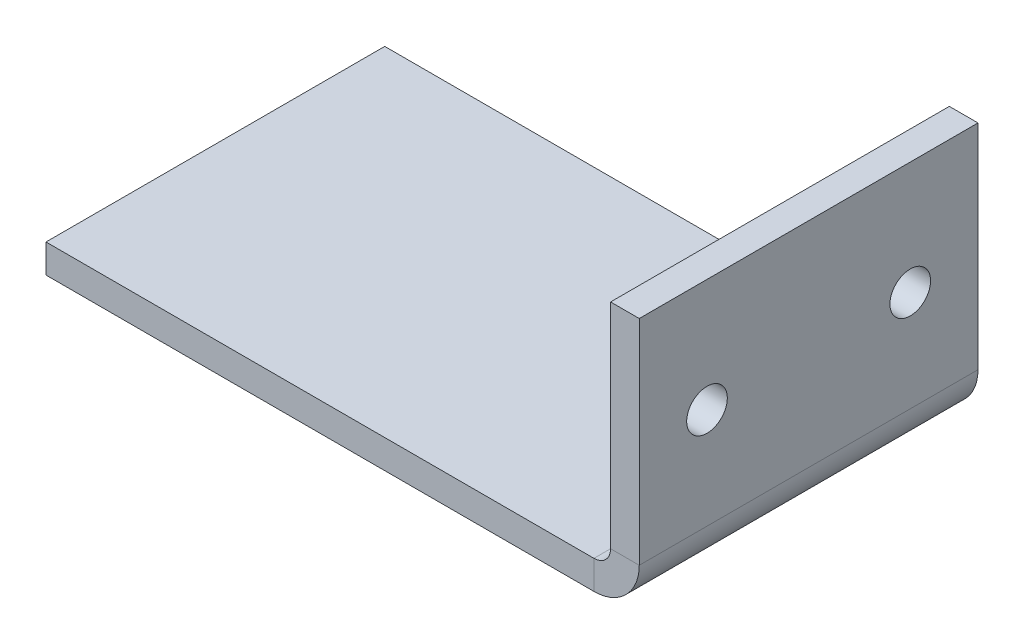
ISO-10303-21;
HEADER;
FILE_DESCRIPTION(('STEP AP214'),'2;1');
FILE_NAME('part.step','',(''),(''),'','','');
FILE_SCHEMA(('AUTOMOTIVE_DESIGN { 1 0 10303 214 1 1 1 1 }'));
ENDSEC;
DATA;
#1=APPLICATION_CONTEXT('core data for automotive mechanical design processes');
#2=APPLICATION_PROTOCOL_DEFINITION('international standard','automotive_design',2000,#1);
#3=PRODUCT_CONTEXT('',#1,'mechanical');
#4=PRODUCT('Part','Part','',(#3));
#5=PRODUCT_RELATED_PRODUCT_CATEGORY('part','',(#4));
#6=PRODUCT_DEFINITION_FORMATION('','',#4);
#7=PRODUCT_DEFINITION_CONTEXT('part definition',#1,'design');
#8=PRODUCT_DEFINITION('design','',#6,#7);
#9=PRODUCT_DEFINITION_SHAPE('','',#8);
#10=(LENGTH_UNIT() NAMED_UNIT(*) SI_UNIT(.MILLI.,.METRE.));
#11=(NAMED_UNIT(*) PLANE_ANGLE_UNIT() SI_UNIT($,.RADIAN.));
#12=(NAMED_UNIT(*) SI_UNIT($,.STERADIAN.) SOLID_ANGLE_UNIT());
#13=UNCERTAINTY_MEASURE_WITH_UNIT(LENGTH_MEASURE(1.E-05),#10,'distance_accuracy_value','');
#14=(GEOMETRIC_REPRESENTATION_CONTEXT(3) GLOBAL_UNCERTAINTY_ASSIGNED_CONTEXT((#13)) GLOBAL_UNIT_ASSIGNED_CONTEXT((#10,
#11,#12)) REPRESENTATION_CONTEXT('',''));
#15=CARTESIAN_POINT('',(0.,0.,0.));
#16=DIRECTION('',(0.,0.,1.));
#17=DIRECTION('',(1.,0.,0.));
#18=AXIS2_PLACEMENT_3D('',#15,#16,#17);
#19=CARTESIAN_POINT('',(-12.5,-1.27,-7.5));
#20=DIRECTION('',(0.,0.,-1.));
#21=DIRECTION('',(-1.,0.,0.));
#22=AXIS2_PLACEMENT_3D('',#19,#20,#21);
#23=PLANE('',#22);
#24=DIRECTION('',(-1.,0.,0.));
#25=VECTOR('',#24,1.);
#26=CARTESIAN_POINT('',(-12.5,0.,-7.5));
#27=LINE('',#26,#25);
#28=CARTESIAN_POINT('',(11.7634,0.,-7.5));
#29=VERTEX_POINT('',#28);
#30=CARTESIAN_POINT('',(-12.5,0.,-7.5));
#31=VERTEX_POINT('',#30);
#32=EDGE_CURVE('E87',#29,#31,#27,.T.);
#33=ORIENTED_EDGE('',*,*,#32,.F.);
#34=DIRECTION('',(0.,-1.,0.));
#35=VECTOR('',#34,1.);
#36=CARTESIAN_POINT('',(11.7634,0.,-7.5));
#37=LINE('',#36,#35);
#38=CARTESIAN_POINT('',(11.7634,-1.27,-7.5));
#39=VERTEX_POINT('',#38);
#40=EDGE_CURVE('E102',#29,#39,#37,.T.);
#41=ORIENTED_EDGE('',*,*,#40,.T.);
#42=DIRECTION('',(-1.,0.,0.));
#43=VECTOR('',#42,1.);
#44=CARTESIAN_POINT('',(-12.5,-1.27,-7.5));
#45=LINE('',#44,#43);
#46=CARTESIAN_POINT('',(-12.5,-1.27,-7.5));
#47=VERTEX_POINT('',#46);
#48=EDGE_CURVE('E94',#39,#47,#45,.T.);
#49=ORIENTED_EDGE('',*,*,#48,.T.);
#50=DIRECTION('',(0.,1.,0.));
#51=VECTOR('',#50,1.);
#52=CARTESIAN_POINT('',(-12.5,-1.27,-7.5));
#53=LINE('',#52,#51);
#54=EDGE_CURVE('E48',#47,#31,#53,.T.);
#55=ORIENTED_EDGE('',*,*,#54,.T.);
#56=EDGE_LOOP('',(#33,#41,#49,#55));
#57=FACE_BOUND('',#56,.T.);
#58=ADVANCED_FACE('F45',(#57),#23,.T.);
#59=CARTESIAN_POINT('',(0.,-1.27,0.));
#60=DIRECTION('',(0.,1.,0.));
#61=DIRECTION('',(0.,0.,1.));
#62=AXIS2_PLACEMENT_3D('',#59,#60,#61);
#63=PLANE('',#62);
#64=DIRECTION('',(0.,0.,-1.));
#65=VECTOR('',#64,1.);
#66=CARTESIAN_POINT('',(11.7634,-1.27,-7.5));
#67=LINE('',#66,#65);
#68=CARTESIAN_POINT('',(11.7634,-1.27,7.5));
#69=VERTEX_POINT('',#68);
#70=EDGE_CURVE('E118',#39,#69,#67,.F.);
#71=ORIENTED_EDGE('',*,*,#70,.T.);
#72=DIRECTION('',(1.,0.,0.));
#73=VECTOR('',#72,1.);
#74=CARTESIAN_POINT('',(-12.5,-1.27,7.5));
#75=LINE('',#74,#73);
#76=CARTESIAN_POINT('',(-12.5,-1.27,7.5));
#77=VERTEX_POINT('',#76);
#78=EDGE_CURVE('E99',#77,#69,#75,.T.);
#79=ORIENTED_EDGE('',*,*,#78,.F.);
#80=DIRECTION('',(0.,0.,1.));
#81=VECTOR('',#80,1.);
#82=CARTESIAN_POINT('',(-12.5,-1.27,-7.5));
#83=LINE('',#82,#81);
#84=EDGE_CURVE('E82',#47,#77,#83,.T.);
#85=ORIENTED_EDGE('',*,*,#84,.F.);
#86=ORIENTED_EDGE('',*,*,#48,.F.);
#87=EDGE_LOOP('',(#71,#79,#85,#86));
#88=FACE_BOUND('',#87,.T.);
#89=ADVANCED_FACE('F222',(#88),#63,.F.);
#90=CARTESIAN_POINT('',(0.,0.,0.));
#91=DIRECTION('',(0.,1.,0.));
#92=DIRECTION('',(0.,0.,1.));
#93=AXIS2_PLACEMENT_3D('',#90,#91,#92);
#94=PLANE('',#93);
#95=DIRECTION('',(1.,0.,0.));
#96=VECTOR('',#95,1.);
#97=CARTESIAN_POINT('',(-12.5,0.,7.5));
#98=LINE('',#97,#96);
#99=CARTESIAN_POINT('',(-12.5,0.,7.5));
#100=VERTEX_POINT('',#99);
#101=CARTESIAN_POINT('',(11.7634,0.,7.5));
#102=VERTEX_POINT('',#101);
#103=EDGE_CURVE('E86',#100,#102,#98,.T.);
#104=ORIENTED_EDGE('',*,*,#103,.T.);
#105=DIRECTION('',(0.,0.,-1.));
#106=VECTOR('',#105,1.);
#107=CARTESIAN_POINT('',(11.7634,0.,-7.5));
#108=LINE('',#107,#106);
#109=EDGE_CURVE('E59',#29,#102,#108,.F.);
#110=ORIENTED_EDGE('',*,*,#109,.F.);
#111=ORIENTED_EDGE('',*,*,#32,.T.);
#112=DIRECTION('',(0.,0.,1.));
#113=VECTOR('',#112,1.);
#114=CARTESIAN_POINT('',(-12.5,0.,-7.5));
#115=LINE('',#114,#113);
#116=EDGE_CURVE('E80',#31,#100,#115,.T.);
#117=ORIENTED_EDGE('',*,*,#116,.T.);
#118=EDGE_LOOP('',(#104,#110,#111,#117));
#119=FACE_BOUND('',#118,.T.);
#120=ADVANCED_FACE('F84',(#119),#94,.T.);
#121=CARTESIAN_POINT('',(-12.5,-1.27,7.5));
#122=DIRECTION('',(0.,0.,1.));
#123=DIRECTION('',(1.,0.,0.));
#124=AXIS2_PLACEMENT_3D('',#121,#122,#123);
#125=PLANE('',#124);
#126=DIRECTION('',(0.,-1.,0.));
#127=VECTOR('',#126,1.);
#128=CARTESIAN_POINT('',(11.7634,0.,7.5));
#129=LINE('',#128,#127);
#130=EDGE_CURVE('E93',#102,#69,#129,.T.);
#131=ORIENTED_EDGE('',*,*,#130,.F.);
#132=ORIENTED_EDGE('',*,*,#103,.F.);
#133=DIRECTION('',(0.,1.,0.));
#134=VECTOR('',#133,1.);
#135=CARTESIAN_POINT('',(-12.5,-1.27,7.5));
#136=LINE('',#135,#134);
#137=EDGE_CURVE('E11',#77,#100,#136,.T.);
#138=ORIENTED_EDGE('',*,*,#137,.F.);
#139=ORIENTED_EDGE('',*,*,#78,.T.);
#140=EDGE_LOOP('',(#131,#132,#138,#139));
#141=FACE_BOUND('',#140,.T.);
#142=ADVANCED_FACE('F91',(#141),#125,.T.);
#143=CARTESIAN_POINT('',(-12.5,-1.27,-7.5));
#144=DIRECTION('',(-1.,0.,0.));
#145=DIRECTION('',(0.,0.,1.));
#146=AXIS2_PLACEMENT_3D('',#143,#144,#145);
#147=PLANE('',#146);
#148=ORIENTED_EDGE('',*,*,#116,.F.);
#149=ORIENTED_EDGE('',*,*,#54,.F.);
#150=ORIENTED_EDGE('',*,*,#84,.T.);
#151=ORIENTED_EDGE('',*,*,#137,.T.);
#152=EDGE_LOOP('',(#148,#149,#150,#151));
#153=FACE_BOUND('',#152,.T.);
#154=ADVANCED_FACE('F78',(#153),#147,.T.);
#155=CARTESIAN_POINT('',(11.7634,0.7366,7.5));
#156=DIRECTION('',(0.,0.,1.));
#157=DIRECTION('',(0.,-1.,0.));
#158=AXIS2_PLACEMENT_3D('',#155,#156,#157);
#159=PLANE('',#158);
#160=DIRECTION('',(1.,0.,0.));
#161=VECTOR('',#160,1.);
#162=CARTESIAN_POINT('',(12.5,0.736599999999997,7.5));
#163=LINE('',#162,#161);
#164=CARTESIAN_POINT('',(12.5,0.736599999999997,7.5));
#165=VERTEX_POINT('',#164);
#166=CARTESIAN_POINT('',(13.77,0.736599999999993,7.5));
#167=VERTEX_POINT('',#166);
#168=EDGE_CURVE('E152',#165,#167,#163,.T.);
#169=ORIENTED_EDGE('',*,*,#168,.F.);
#170=CARTESIAN_POINT('',(11.7634,0.7366,7.5));
#171=DIRECTION('',(0.,0.,-1.));
#172=DIRECTION('',(0.,1.,0.));
#173=AXIS2_PLACEMENT_3D('',#170,#171,#172);
#174=CIRCLE('',#173,0.7366);
#175=EDGE_CURVE('E112',#102,#165,#174,.F.);
#176=ORIENTED_EDGE('',*,*,#175,.F.);
#177=ORIENTED_EDGE('',*,*,#130,.T.);
#178=CARTESIAN_POINT('',(11.7634,0.7366,7.5));
#179=DIRECTION('',(0.,0.,-1.));
#180=DIRECTION('',(0.,1.,0.));
#181=AXIS2_PLACEMENT_3D('',#178,#179,#180);
#182=CIRCLE('',#181,2.0066);
#183=EDGE_CURVE('E105',#69,#167,#182,.F.);
#184=ORIENTED_EDGE('',*,*,#183,.T.);
#185=EDGE_LOOP('',(#169,#176,#177,#184));
#186=FACE_BOUND('',#185,.T.);
#187=ADVANCED_FACE('F225',(#186),#159,.T.);
#188=CARTESIAN_POINT('',(11.7634,0.736599999999997,-7.5));
#189=DIRECTION('',(0.,0.,1.));
#190=DIRECTION('',(0.,-1.,0.));
#191=AXIS2_PLACEMENT_3D('',#188,#189,#190);
#192=PLANE('',#191);
#193=CARTESIAN_POINT('',(11.7634,0.736599999999997,-7.5));
#194=DIRECTION('',(0.,0.,-1.));
#195=DIRECTION('',(0.,1.,0.));
#196=AXIS2_PLACEMENT_3D('',#193,#194,#195);
#197=CIRCLE('',#196,0.7366);
#198=CARTESIAN_POINT('',(12.5,0.736599999999995,-7.5));
#199=VERTEX_POINT('',#198);
#200=EDGE_CURVE('E107',#199,#29,#197,.T.);
#201=ORIENTED_EDGE('',*,*,#200,.F.);
#202=DIRECTION('',(1.,0.,0.));
#203=VECTOR('',#202,1.);
#204=CARTESIAN_POINT('',(12.5,0.736599999999995,-7.5));
#205=LINE('',#204,#203);
#206=CARTESIAN_POINT('',(13.77,0.736599999999991,-7.5));
#207=VERTEX_POINT('',#206);
#208=EDGE_CURVE('E151',#199,#207,#205,.T.);
#209=ORIENTED_EDGE('',*,*,#208,.T.);
#210=CARTESIAN_POINT('',(11.7634,0.736599999999997,-7.5));
#211=DIRECTION('',(0.,0.,-1.));
#212=DIRECTION('',(0.,1.,0.));
#213=AXIS2_PLACEMENT_3D('',#210,#211,#212);
#214=CIRCLE('',#213,2.0066);
#215=EDGE_CURVE('E115',#207,#39,#214,.T.);
#216=ORIENTED_EDGE('',*,*,#215,.T.);
#217=ORIENTED_EDGE('',*,*,#40,.F.);
#218=EDGE_LOOP('',(#201,#209,#216,#217));
#219=FACE_BOUND('',#218,.T.);
#220=ADVANCED_FACE('F229',(#219),#192,.F.);
#221=CARTESIAN_POINT('',(11.7634,0.736599999999997,-7.5));
#222=DIRECTION('',(0.,0.,-1.));
#223=DIRECTION('',(1.,0.,0.));
#224=AXIS2_PLACEMENT_3D('',#221,#222,#223);
#225=CYLINDRICAL_SURFACE('',#224,2.0066);
#226=ORIENTED_EDGE('',*,*,#70,.F.);
#227=ORIENTED_EDGE('',*,*,#215,.F.);
#228=DIRECTION('',(0.,0.,1.));
#229=VECTOR('',#228,1.);
#230=CARTESIAN_POINT('',(13.77,0.736599999999992,0.));
#231=LINE('',#230,#229);
#232=EDGE_CURVE('E140',#207,#167,#231,.T.);
#233=ORIENTED_EDGE('',*,*,#232,.T.);
#234=ORIENTED_EDGE('',*,*,#183,.F.);
#235=EDGE_LOOP('',(#226,#227,#233,#234));
#236=FACE_BOUND('',#235,.T.);
#237=ADVANCED_FACE('F226',(#236),#225,.T.);
#238=CARTESIAN_POINT('',(11.7634,0.736599999999997,-7.5));
#239=DIRECTION('',(0.,0.,-1.));
#240=DIRECTION('',(1.,0.,0.));
#241=AXIS2_PLACEMENT_3D('',#238,#239,#240);
#242=CYLINDRICAL_SURFACE('',#241,0.7366);
#243=ORIENTED_EDGE('',*,*,#109,.T.);
#244=ORIENTED_EDGE('',*,*,#175,.T.);
#245=DIRECTION('',(0.,0.,-1.));
#246=VECTOR('',#245,1.);
#247=CARTESIAN_POINT('',(12.5,0.736599999999997,7.5));
#248=LINE('',#247,#246);
#249=EDGE_CURVE('E155',#165,#199,#248,.T.);
#250=ORIENTED_EDGE('',*,*,#249,.T.);
#251=ORIENTED_EDGE('',*,*,#200,.T.);
#252=EDGE_LOOP('',(#243,#244,#250,#251));
#253=FACE_BOUND('',#252,.T.);
#254=ADVANCED_FACE('F228',(#253),#242,.F.);
#255=CARTESIAN_POINT('',(13.77,10.2,-7.5));
#256=DIRECTION('',(0.,0.,1.));
#257=DIRECTION('',(1.,0.,0.));
#258=AXIS2_PLACEMENT_3D('',#255,#256,#257);
#259=PLANE('',#258);
#260=ORIENTED_EDGE('',*,*,#208,.F.);
#261=DIRECTION('',(0.,1.,0.));
#262=VECTOR('',#261,1.);
#263=CARTESIAN_POINT('',(12.5,10.2,-7.5));
#264=LINE('',#263,#262);
#265=CARTESIAN_POINT('',(12.5,10.2,-7.5));
#266=VERTEX_POINT('',#265);
#267=EDGE_CURVE('E136',#199,#266,#264,.T.);
#268=ORIENTED_EDGE('',*,*,#267,.T.);
#269=DIRECTION('',(-1.,0.,0.));
#270=VECTOR('',#269,1.);
#271=CARTESIAN_POINT('',(13.77,10.2,-7.5));
#272=LINE('',#271,#270);
#273=CARTESIAN_POINT('',(13.77,10.2,-7.5));
#274=VERTEX_POINT('',#273);
#275=EDGE_CURVE('E110',#274,#266,#272,.T.);
#276=ORIENTED_EDGE('',*,*,#275,.F.);
#277=DIRECTION('',(0.,1.,0.));
#278=VECTOR('',#277,1.);
#279=CARTESIAN_POINT('',(13.77,10.2,-7.5));
#280=LINE('',#279,#278);
#281=EDGE_CURVE('E132',#207,#274,#280,.T.);
#282=ORIENTED_EDGE('',*,*,#281,.F.);
#283=EDGE_LOOP('',(#260,#268,#276,#282));
#284=FACE_BOUND('',#283,.T.);
#285=ADVANCED_FACE('F197',(#284),#259,.F.);
#286=CARTESIAN_POINT('',(13.77,0.,7.5));
#287=DIRECTION('',(0.,0.,-1.));
#288=DIRECTION('',(-1.,0.,0.));
#289=AXIS2_PLACEMENT_3D('',#286,#287,#288);
#290=PLANE('',#289);
#291=ORIENTED_EDGE('',*,*,#168,.T.);
#292=DIRECTION('',(0.,-1.,0.));
#293=VECTOR('',#292,1.);
#294=CARTESIAN_POINT('',(13.77,0.,7.5));
#295=LINE('',#294,#293);
#296=CARTESIAN_POINT('',(13.77,10.2,7.5));
#297=VERTEX_POINT('',#296);
#298=EDGE_CURVE('E128',#297,#167,#295,.T.);
#299=ORIENTED_EDGE('',*,*,#298,.F.);
#300=DIRECTION('',(-1.,0.,0.));
#301=VECTOR('',#300,1.);
#302=CARTESIAN_POINT('',(13.77,10.2,7.5));
#303=LINE('',#302,#301);
#304=CARTESIAN_POINT('',(12.5,10.2,7.5));
#305=VERTEX_POINT('',#304);
#306=EDGE_CURVE('E125',#297,#305,#303,.T.);
#307=ORIENTED_EDGE('',*,*,#306,.T.);
#308=DIRECTION('',(0.,-1.,0.));
#309=VECTOR('',#308,1.);
#310=CARTESIAN_POINT('',(12.5,0.,7.5));
#311=LINE('',#310,#309);
#312=EDGE_CURVE('E129',#305,#165,#311,.T.);
#313=ORIENTED_EDGE('',*,*,#312,.T.);
#314=EDGE_LOOP('',(#291,#299,#307,#313));
#315=FACE_BOUND('',#314,.T.);
#316=ADVANCED_FACE('F179',(#315),#290,.F.);
#317=CARTESIAN_POINT('',(13.77,0.,0.));
#318=DIRECTION('',(-1.,0.,0.));
#319=DIRECTION('',(0.,-1.,0.));
#320=AXIS2_PLACEMENT_3D('',#317,#318,#319);
#321=PLANE('',#320);
#322=CARTESIAN_POINT('',(13.77,5.19999999999999,4.5));
#323=DIRECTION('',(1.,0.,0.));
#324=DIRECTION('',(0.,0.,-1.));
#325=AXIS2_PLACEMENT_3D('',#322,#323,#324);
#326=CIRCLE('',#325,0.899999999999999);
#327=CARTESIAN_POINT('',(13.77,5.19999999999999,3.6));
#328=VERTEX_POINT('',#327);
#329=EDGE_CURVE('E169',#328,#328,#326,.T.);
#330=ORIENTED_EDGE('',*,*,#329,.F.);
#331=EDGE_LOOP('',(#330));
#332=FACE_BOUND('',#331,.T.);
#333=CARTESIAN_POINT('',(13.77,5.19999999999999,-4.5));
#334=DIRECTION('',(1.,0.,0.));
#335=DIRECTION('',(0.,0.,-1.));
#336=AXIS2_PLACEMENT_3D('',#333,#334,#335);
#337=CIRCLE('',#336,0.899999999999999);
#338=CARTESIAN_POINT('',(13.77,5.19999999999999,-5.4));
#339=VERTEX_POINT('',#338);
#340=EDGE_CURVE('E163',#339,#339,#337,.T.);
#341=ORIENTED_EDGE('',*,*,#340,.F.);
#342=EDGE_LOOP('',(#341));
#343=FACE_BOUND('',#342,.T.);
#344=ORIENTED_EDGE('',*,*,#232,.F.);
#345=ORIENTED_EDGE('',*,*,#281,.T.);
#346=DIRECTION('',(0.,0.,1.));
#347=VECTOR('',#346,1.);
#348=CARTESIAN_POINT('',(13.77,10.2,7.5));
#349=LINE('',#348,#347);
#350=EDGE_CURVE('E143',#274,#297,#349,.T.);
#351=ORIENTED_EDGE('',*,*,#350,.T.);
#352=ORIENTED_EDGE('',*,*,#298,.T.);
#353=EDGE_LOOP('',(#344,#345,#351,#352));
#354=FACE_BOUND('',#353,.T.);
#355=ADVANCED_FACE('F175',(#332,#343,#354),#321,.F.);
#356=CARTESIAN_POINT('',(12.5,0.,0.));
#357=DIRECTION('',(-1.,0.,0.));
#358=DIRECTION('',(0.,-1.,0.));
#359=AXIS2_PLACEMENT_3D('',#356,#357,#358);
#360=PLANE('',#359);
#361=CARTESIAN_POINT('',(12.5,5.19999999999999,4.5));
#362=DIRECTION('',(-1.,0.,0.));
#363=DIRECTION('',(0.,-1.,0.));
#364=AXIS2_PLACEMENT_3D('',#361,#362,#363);
#365=CIRCLE('',#364,0.899999999999998);
#366=CARTESIAN_POINT('',(12.5,4.3,4.5));
#367=VERTEX_POINT('',#366);
#368=EDGE_CURVE('E166',#367,#367,#365,.T.);
#369=ORIENTED_EDGE('',*,*,#368,.F.);
#370=EDGE_LOOP('',(#369));
#371=FACE_BOUND('',#370,.T.);
#372=CARTESIAN_POINT('',(12.5,5.19999999999999,-4.5));
#373=DIRECTION('',(-1.,0.,0.));
#374=DIRECTION('',(0.,-1.,0.));
#375=AXIS2_PLACEMENT_3D('',#372,#373,#374);
#376=CIRCLE('',#375,0.899999999999998);
#377=CARTESIAN_POINT('',(12.5,4.3,-4.5));
#378=VERTEX_POINT('',#377);
#379=EDGE_CURVE('E156',#378,#378,#376,.T.);
#380=ORIENTED_EDGE('',*,*,#379,.F.);
#381=EDGE_LOOP('',(#380));
#382=FACE_BOUND('',#381,.T.);
#383=ORIENTED_EDGE('',*,*,#267,.F.);
#384=ORIENTED_EDGE('',*,*,#249,.F.);
#385=ORIENTED_EDGE('',*,*,#312,.F.);
#386=DIRECTION('',(0.,0.,1.));
#387=VECTOR('',#386,1.);
#388=CARTESIAN_POINT('',(12.5,10.2,7.5));
#389=LINE('',#388,#387);
#390=EDGE_CURVE('E133',#266,#305,#389,.T.);
#391=ORIENTED_EDGE('',*,*,#390,.F.);
#392=EDGE_LOOP('',(#383,#384,#385,#391));
#393=FACE_BOUND('',#392,.T.);
#394=ADVANCED_FACE('F178',(#371,#382,#393),#360,.T.);
#395=CARTESIAN_POINT('',(13.77,10.2,7.5));
#396=DIRECTION('',(0.,-1.,0.));
#397=DIRECTION('',(1.,0.,0.));
#398=AXIS2_PLACEMENT_3D('',#395,#396,#397);
#399=PLANE('',#398);
#400=ORIENTED_EDGE('',*,*,#390,.T.);
#401=ORIENTED_EDGE('',*,*,#306,.F.);
#402=ORIENTED_EDGE('',*,*,#350,.F.);
#403=ORIENTED_EDGE('',*,*,#275,.T.);
#404=EDGE_LOOP('',(#400,#401,#402,#403));
#405=FACE_BOUND('',#404,.T.);
#406=ADVANCED_FACE('F207',(#405),#399,.F.);
#407=CARTESIAN_POINT('',(13.77,5.19999999999999,-4.5));
#408=DIRECTION('',(1.,0.,0.));
#409=DIRECTION('',(0.,0.,-1.));
#410=AXIS2_PLACEMENT_3D('',#407,#408,#409);
#411=CYLINDRICAL_SURFACE('',#410,0.899999999999998);
#412=ORIENTED_EDGE('',*,*,#379,.T.);
#413=EDGE_LOOP('',(#412));
#414=FACE_BOUND('',#413,.T.);
#415=ORIENTED_EDGE('',*,*,#340,.T.);
#416=EDGE_LOOP('',(#415));
#417=FACE_BOUND('',#416,.T.);
#418=ADVANCED_FACE('F261',(#414,#417),#411,.F.);
#419=CARTESIAN_POINT('',(13.77,5.19999999999999,4.5));
#420=DIRECTION('',(1.,0.,0.));
#421=DIRECTION('',(0.,0.,-1.));
#422=AXIS2_PLACEMENT_3D('',#419,#420,#421);
#423=CYLINDRICAL_SURFACE('',#422,0.899999999999998);
#424=ORIENTED_EDGE('',*,*,#368,.T.);
#425=EDGE_LOOP('',(#424));
#426=FACE_BOUND('',#425,.T.);
#427=ORIENTED_EDGE('',*,*,#329,.T.);
#428=EDGE_LOOP('',(#427));
#429=FACE_BOUND('',#428,.T.);
#430=ADVANCED_FACE('F173',(#426,#429),#423,.F.);
#431=CLOSED_SHELL('',(#58,#89,#120,#142,#154,#187,#220,#237,#254,#285,#316,#355,#394,#406,#418,#430));
#432=MANIFOLD_SOLID_BREP('B2',#431);
#433=ADVANCED_BREP_SHAPE_REPRESENTATION('',(#18,#432),#14);
#434=SHAPE_DEFINITION_REPRESENTATION(#9,#433);
ENDSEC;
END-ISO-10303-21;
